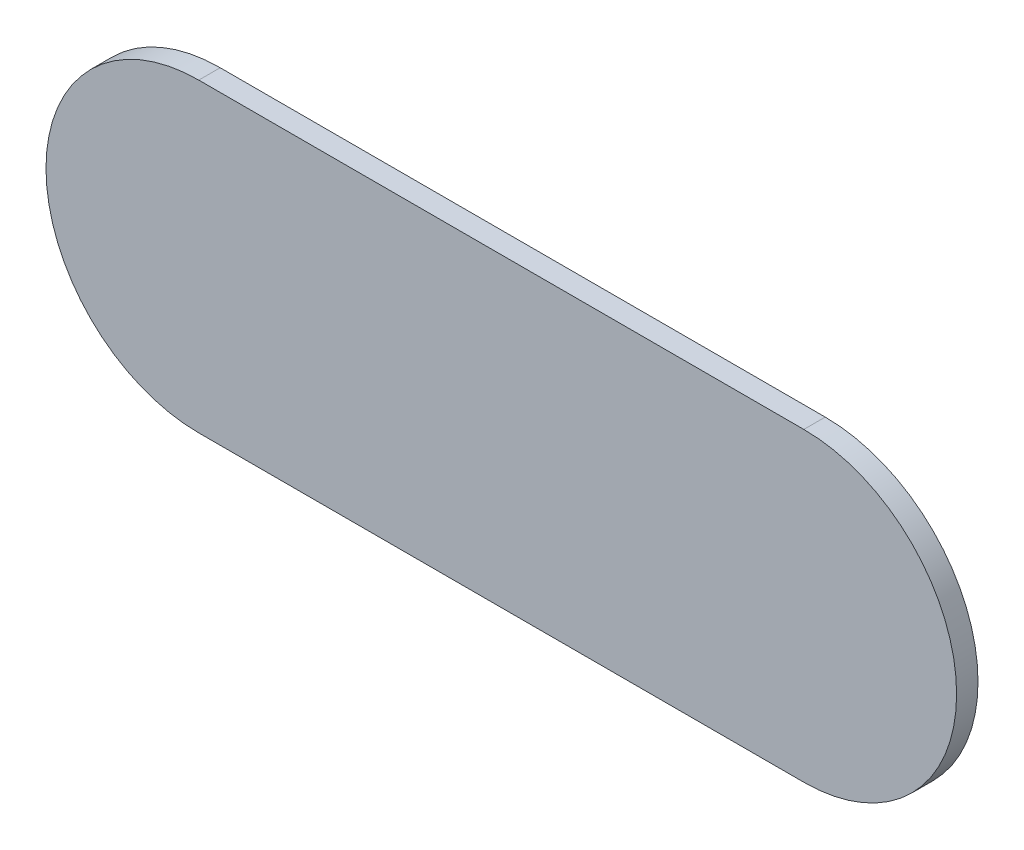
ISO-10303-21;
HEADER;
FILE_DESCRIPTION(('STEP AP214'),'2;1');
FILE_NAME('part.step','',(''),(''),'','','');
FILE_SCHEMA(('AUTOMOTIVE_DESIGN { 1 0 10303 214 1 1 1 1 }'));
ENDSEC;
DATA;
#1=APPLICATION_CONTEXT('core data for automotive mechanical design processes');
#2=APPLICATION_PROTOCOL_DEFINITION('international standard','automotive_design',2000,#1);
#3=PRODUCT_CONTEXT('',#1,'mechanical');
#4=PRODUCT('Part','Part','',(#3));
#5=PRODUCT_RELATED_PRODUCT_CATEGORY('part','',(#4));
#6=PRODUCT_DEFINITION_FORMATION('','',#4);
#7=PRODUCT_DEFINITION_CONTEXT('part definition',#1,'design');
#8=PRODUCT_DEFINITION('design','',#6,#7);
#9=PRODUCT_DEFINITION_SHAPE('','',#8);
#10=(LENGTH_UNIT() NAMED_UNIT(*) SI_UNIT(.MILLI.,.METRE.));
#11=(NAMED_UNIT(*) PLANE_ANGLE_UNIT() SI_UNIT($,.RADIAN.));
#12=(NAMED_UNIT(*) SI_UNIT($,.STERADIAN.) SOLID_ANGLE_UNIT());
#13=UNCERTAINTY_MEASURE_WITH_UNIT(LENGTH_MEASURE(1.E-05),#10,'distance_accuracy_value','');
#14=(GEOMETRIC_REPRESENTATION_CONTEXT(3) GLOBAL_UNCERTAINTY_ASSIGNED_CONTEXT((#13)) GLOBAL_UNIT_ASSIGNED_CONTEXT((#10,
#11,#12)) REPRESENTATION_CONTEXT('',''));
#15=CARTESIAN_POINT('',(0.,0.,0.));
#16=DIRECTION('',(0.,0.,1.));
#17=DIRECTION('',(1.,0.,0.));
#18=AXIS2_PLACEMENT_3D('',#15,#16,#17);
#19=CARTESIAN_POINT('',(134.99,-115.679998,1.635));
#20=DIRECTION('',(0.,0.,1.));
#21=DIRECTION('',(1.,0.,0.));
#22=AXIS2_PLACEMENT_3D('',#19,#20,#21);
#23=PLANE('',#22);
#24=DIRECTION('',(1.,0.,0.));
#25=VECTOR('',#24,1.);
#26=CARTESIAN_POINT('',(134.99,-115.679998,1.635));
#27=LINE('',#26,#25);
#28=CARTESIAN_POINT('',(134.99,-115.679998,1.635));
#29=VERTEX_POINT('',#28);
#30=CARTESIAN_POINT('',(135.98,-115.679998,1.635));
#31=VERTEX_POINT('',#30);
#32=EDGE_CURVE('E82',#29,#31,#27,.T.);
#33=ORIENTED_EDGE('',*,*,#32,.T.);
#34=CARTESIAN_POINT('',(135.98,-115.429998,1.635));
#35=DIRECTION('',(0.,0.,1.));
#36=DIRECTION('',(0.,-1.,0.));
#37=AXIS2_PLACEMENT_3D('',#34,#35,#36);
#38=CIRCLE('',#37,0.25);
#39=CARTESIAN_POINT('',(135.98,-115.179998,1.635));
#40=VERTEX_POINT('',#39);
#41=EDGE_CURVE('E107',#31,#40,#38,.T.);
#42=ORIENTED_EDGE('',*,*,#41,.T.);
#43=DIRECTION('',(-1.,0.,0.));
#44=VECTOR('',#43,1.);
#45=CARTESIAN_POINT('',(135.98,-115.179998,1.635));
#46=LINE('',#45,#44);
#47=CARTESIAN_POINT('',(134.99,-115.179998,1.635));
#48=VERTEX_POINT('',#47);
#49=EDGE_CURVE('E75',#40,#48,#46,.T.);
#50=ORIENTED_EDGE('',*,*,#49,.T.);
#51=CARTESIAN_POINT('',(134.99,-115.429998,1.635));
#52=DIRECTION('',(0.,0.,1.));
#53=DIRECTION('',(0.,1.,0.));
#54=AXIS2_PLACEMENT_3D('',#51,#52,#53);
#55=CIRCLE('',#54,0.25);
#56=EDGE_CURVE('E11',#48,#29,#55,.T.);
#57=ORIENTED_EDGE('',*,*,#56,.T.);
#58=EDGE_LOOP('',(#33,#42,#50,#57));
#59=FACE_BOUND('',#58,.T.);
#60=ADVANCED_FACE('F17',(#59),#23,.T.);
#61=CARTESIAN_POINT('',(134.99,-115.679998,1.6));
#62=DIRECTION('',(0.,0.,1.));
#63=DIRECTION('',(1.,0.,0.));
#64=AXIS2_PLACEMENT_3D('',#61,#62,#63);
#65=PLANE('',#64);
#66=CARTESIAN_POINT('',(134.99,-115.429998,1.6));
#67=DIRECTION('',(0.,0.,1.));
#68=DIRECTION('',(0.,1.,0.));
#69=AXIS2_PLACEMENT_3D('',#66,#67,#68);
#70=CIRCLE('',#69,0.25);
#71=CARTESIAN_POINT('',(134.99,-115.179998,1.6));
#72=VERTEX_POINT('',#71);
#73=CARTESIAN_POINT('',(134.99,-115.679998,1.6));
#74=VERTEX_POINT('',#73);
#75=EDGE_CURVE('E21',#72,#74,#70,.T.);
#76=ORIENTED_EDGE('',*,*,#75,.F.);
#77=DIRECTION('',(-1.,0.,0.));
#78=VECTOR('',#77,1.);
#79=CARTESIAN_POINT('',(135.98,-115.179998,1.6));
#80=LINE('',#79,#78);
#81=CARTESIAN_POINT('',(135.98,-115.179998,1.6));
#82=VERTEX_POINT('',#81);
#83=EDGE_CURVE('E110',#82,#72,#80,.T.);
#84=ORIENTED_EDGE('',*,*,#83,.F.);
#85=CARTESIAN_POINT('',(135.98,-115.429998,1.6));
#86=DIRECTION('',(0.,0.,1.));
#87=DIRECTION('',(0.,-1.,0.));
#88=AXIS2_PLACEMENT_3D('',#85,#86,#87);
#89=CIRCLE('',#88,0.25);
#90=CARTESIAN_POINT('',(135.98,-115.679998,1.6));
#91=VERTEX_POINT('',#90);
#92=EDGE_CURVE('E84',#91,#82,#89,.T.);
#93=ORIENTED_EDGE('',*,*,#92,.F.);
#94=DIRECTION('',(1.,0.,0.));
#95=VECTOR('',#94,1.);
#96=CARTESIAN_POINT('',(134.99,-115.679998,1.6));
#97=LINE('',#96,#95);
#98=EDGE_CURVE('E80',#74,#91,#97,.T.);
#99=ORIENTED_EDGE('',*,*,#98,.F.);
#100=EDGE_LOOP('',(#76,#84,#93,#99));
#101=FACE_BOUND('',#100,.T.);
#102=ADVANCED_FACE('F86',(#101),#65,.F.);
#103=CARTESIAN_POINT('',(134.99,-115.429998,1.6));
#104=DIRECTION('',(0.,0.,-1.));
#105=DIRECTION('',(0.,1.,0.));
#106=AXIS2_PLACEMENT_3D('',#103,#104,#105);
#107=CYLINDRICAL_SURFACE('',#106,0.25);
#108=ORIENTED_EDGE('',*,*,#75,.T.);
#109=DIRECTION('',(0.,0.,1.));
#110=VECTOR('',#109,1.);
#111=CARTESIAN_POINT('',(134.99,-115.679998,1.6));
#112=LINE('',#111,#110);
#113=EDGE_CURVE('E69',#74,#29,#112,.T.);
#114=ORIENTED_EDGE('',*,*,#113,.T.);
#115=ORIENTED_EDGE('',*,*,#56,.F.);
#116=DIRECTION('',(0.,0.,1.));
#117=VECTOR('',#116,1.);
#118=CARTESIAN_POINT('',(134.99,-115.179998,1.6));
#119=LINE('',#118,#117);
#120=EDGE_CURVE('E72',#72,#48,#119,.T.);
#121=ORIENTED_EDGE('',*,*,#120,.F.);
#122=EDGE_LOOP('',(#108,#114,#115,#121));
#123=FACE_BOUND('',#122,.T.);
#124=ADVANCED_FACE('F19',(#123),#107,.T.);
#125=CARTESIAN_POINT('',(135.98,-115.179998,1.6));
#126=DIRECTION('',(0.,-1.,0.));
#127=DIRECTION('',(0.,0.,-1.));
#128=AXIS2_PLACEMENT_3D('',#125,#126,#127);
#129=PLANE('',#128);
#130=ORIENTED_EDGE('',*,*,#83,.T.);
#131=ORIENTED_EDGE('',*,*,#120,.T.);
#132=ORIENTED_EDGE('',*,*,#49,.F.);
#133=DIRECTION('',(0.,0.,1.));
#134=VECTOR('',#133,1.);
#135=CARTESIAN_POINT('',(135.98,-115.179998,1.6));
#136=LINE('',#135,#134);
#137=EDGE_CURVE('E103',#82,#40,#136,.T.);
#138=ORIENTED_EDGE('',*,*,#137,.F.);
#139=EDGE_LOOP('',(#130,#131,#132,#138));
#140=FACE_BOUND('',#139,.T.);
#141=ADVANCED_FACE('F121',(#140),#129,.F.);
#142=CARTESIAN_POINT('',(135.98,-115.429998,1.6));
#143=DIRECTION('',(0.,0.,-1.));
#144=DIRECTION('',(0.,-1.,0.));
#145=AXIS2_PLACEMENT_3D('',#142,#143,#144);
#146=CYLINDRICAL_SURFACE('',#145,0.25);
#147=ORIENTED_EDGE('',*,*,#92,.T.);
#148=ORIENTED_EDGE('',*,*,#137,.T.);
#149=ORIENTED_EDGE('',*,*,#41,.F.);
#150=DIRECTION('',(0.,0.,1.));
#151=VECTOR('',#150,1.);
#152=CARTESIAN_POINT('',(135.98,-115.679998,1.6));
#153=LINE('',#152,#151);
#154=EDGE_CURVE('E90',#91,#31,#153,.T.);
#155=ORIENTED_EDGE('',*,*,#154,.F.);
#156=EDGE_LOOP('',(#147,#148,#149,#155));
#157=FACE_BOUND('',#156,.T.);
#158=ADVANCED_FACE('F124',(#157),#146,.T.);
#159=CARTESIAN_POINT('',(134.99,-115.679998,1.6));
#160=DIRECTION('',(0.,1.,0.));
#161=DIRECTION('',(1.,0.,0.));
#162=AXIS2_PLACEMENT_3D('',#159,#160,#161);
#163=PLANE('',#162);
#164=ORIENTED_EDGE('',*,*,#98,.T.);
#165=ORIENTED_EDGE('',*,*,#154,.T.);
#166=ORIENTED_EDGE('',*,*,#32,.F.);
#167=ORIENTED_EDGE('',*,*,#113,.F.);
#168=EDGE_LOOP('',(#164,#165,#166,#167));
#169=FACE_BOUND('',#168,.T.);
#170=ADVANCED_FACE('F78',(#169),#163,.F.);
#171=CLOSED_SHELL('',(#60,#102,#124,#141,#158,#170));
#172=MANIFOLD_SOLID_BREP('B1',#171);
#173=ADVANCED_BREP_SHAPE_REPRESENTATION('',(#18,#172),#14);
#174=SHAPE_DEFINITION_REPRESENTATION(#9,#173);
ENDSEC;
END-ISO-10303-21;
